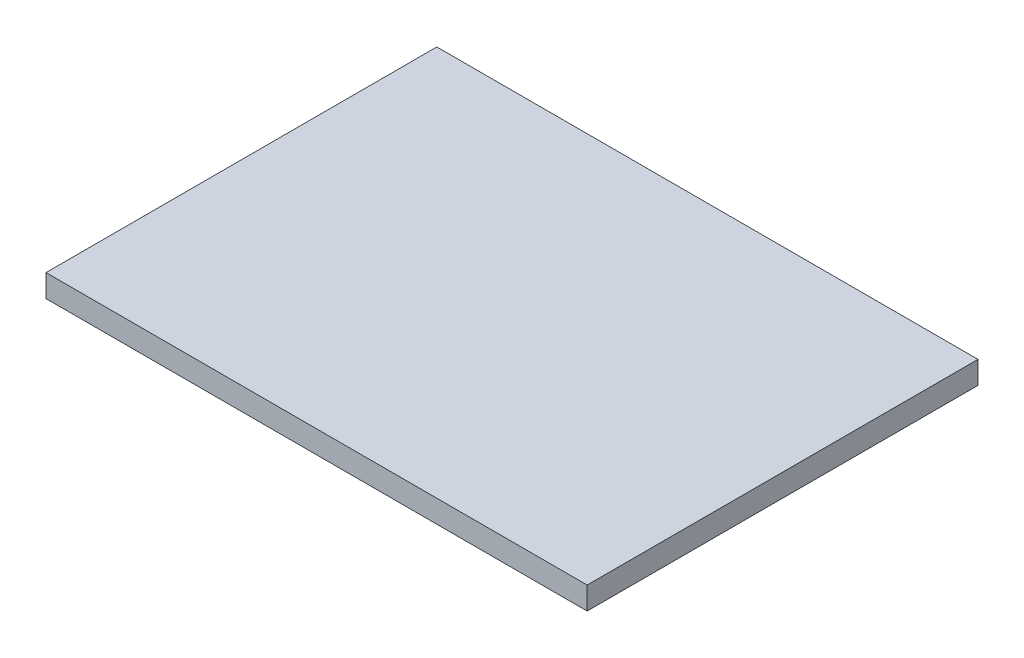
ISO-10303-21;
HEADER;
FILE_DESCRIPTION(('STEP AP214'),'2;1');
FILE_NAME('part.step','',(''),(''),'','','');
FILE_SCHEMA(('AUTOMOTIVE_DESIGN { 1 0 10303 214 1 1 1 1 }'));
ENDSEC;
DATA;
#1=APPLICATION_CONTEXT('core data for automotive mechanical design processes');
#2=APPLICATION_PROTOCOL_DEFINITION('international standard','automotive_design',2000,#1);
#3=PRODUCT_CONTEXT('',#1,'mechanical');
#4=PRODUCT('Part','Part','',(#3));
#5=PRODUCT_RELATED_PRODUCT_CATEGORY('part','',(#4));
#6=PRODUCT_DEFINITION_FORMATION('','',#4);
#7=PRODUCT_DEFINITION_CONTEXT('part definition',#1,'design');
#8=PRODUCT_DEFINITION('design','',#6,#7);
#9=PRODUCT_DEFINITION_SHAPE('','',#8);
#10=(LENGTH_UNIT() NAMED_UNIT(*) SI_UNIT(.MILLI.,.METRE.));
#11=(NAMED_UNIT(*) PLANE_ANGLE_UNIT() SI_UNIT($,.RADIAN.));
#12=(NAMED_UNIT(*) SI_UNIT($,.STERADIAN.) SOLID_ANGLE_UNIT());
#13=UNCERTAINTY_MEASURE_WITH_UNIT(LENGTH_MEASURE(1.E-05),#10,'distance_accuracy_value','');
#14=(GEOMETRIC_REPRESENTATION_CONTEXT(3) GLOBAL_UNCERTAINTY_ASSIGNED_CONTEXT((#13)) GLOBAL_UNIT_ASSIGNED_CONTEXT((#10,
#11,#12)) REPRESENTATION_CONTEXT('',''));
#15=CARTESIAN_POINT('',(0.,0.,0.));
#16=DIRECTION('',(0.,0.,1.));
#17=DIRECTION('',(1.,0.,0.));
#18=AXIS2_PLACEMENT_3D('',#15,#16,#17);
#19=CARTESIAN_POINT('',(36.,3.,26.));
#20=DIRECTION('',(-1.,0.,0.));
#21=DIRECTION('',(0.,0.,1.));
#22=AXIS2_PLACEMENT_3D('',#19,#20,#21);
#23=PLANE('',#22);
#24=DIRECTION('',(0.,0.,-1.));
#25=VECTOR('',#24,1.);
#26=CARTESIAN_POINT('',(36.,0.,26.));
#27=LINE('',#26,#25);
#28=CARTESIAN_POINT('',(36.,0.,26.));
#29=VERTEX_POINT('',#28);
#30=CARTESIAN_POINT('',(36.,0.,-26.));
#31=VERTEX_POINT('',#30);
#32=EDGE_CURVE('E98',#29,#31,#27,.T.);
#33=ORIENTED_EDGE('',*,*,#32,.T.);
#34=DIRECTION('',(0.,-1.,0.));
#35=VECTOR('',#34,1.);
#36=CARTESIAN_POINT('',(36.,3.,-26.));
#37=LINE('',#36,#35);
#38=CARTESIAN_POINT('',(36.,3.,-26.));
#39=VERTEX_POINT('',#38);
#40=EDGE_CURVE('E11',#39,#31,#37,.T.);
#41=ORIENTED_EDGE('',*,*,#40,.F.);
#42=DIRECTION('',(0.,0.,-1.));
#43=VECTOR('',#42,1.);
#44=CARTESIAN_POINT('',(36.,3.,26.));
#45=LINE('',#44,#43);
#46=CARTESIAN_POINT('',(36.,3.,26.));
#47=VERTEX_POINT('',#46);
#48=EDGE_CURVE('E86',#47,#39,#45,.T.);
#49=ORIENTED_EDGE('',*,*,#48,.F.);
#50=DIRECTION('',(0.,-1.,0.));
#51=VECTOR('',#50,1.);
#52=CARTESIAN_POINT('',(36.,3.,26.));
#53=LINE('',#52,#51);
#54=EDGE_CURVE('E94',#47,#29,#53,.T.);
#55=ORIENTED_EDGE('',*,*,#54,.T.);
#56=EDGE_LOOP('',(#33,#41,#49,#55));
#57=FACE_BOUND('',#56,.T.);
#58=ADVANCED_FACE('F35',(#57),#23,.F.);
#59=CARTESIAN_POINT('',(-36.,3.,-26.));
#60=DIRECTION('',(0.,0.,1.));
#61=DIRECTION('',(1.,0.,0.));
#62=AXIS2_PLACEMENT_3D('',#59,#60,#61);
#63=PLANE('',#62);
#64=DIRECTION('',(-1.,0.,0.));
#65=VECTOR('',#64,1.);
#66=CARTESIAN_POINT('',(-36.,0.,-26.));
#67=LINE('',#66,#65);
#68=CARTESIAN_POINT('',(-36.,0.,-26.));
#69=VERTEX_POINT('',#68);
#70=EDGE_CURVE('E90',#31,#69,#67,.T.);
#71=ORIENTED_EDGE('',*,*,#70,.T.);
#72=DIRECTION('',(0.,-1.,0.));
#73=VECTOR('',#72,1.);
#74=CARTESIAN_POINT('',(-36.,3.,-26.));
#75=LINE('',#74,#73);
#76=CARTESIAN_POINT('',(-36.,3.,-26.));
#77=VERTEX_POINT('',#76);
#78=EDGE_CURVE('E43',#77,#69,#75,.T.);
#79=ORIENTED_EDGE('',*,*,#78,.F.);
#80=DIRECTION('',(-1.,0.,0.));
#81=VECTOR('',#80,1.);
#82=CARTESIAN_POINT('',(-36.,3.,-26.));
#83=LINE('',#82,#81);
#84=EDGE_CURVE('E81',#39,#77,#83,.T.);
#85=ORIENTED_EDGE('',*,*,#84,.F.);
#86=ORIENTED_EDGE('',*,*,#40,.T.);
#87=EDGE_LOOP('',(#71,#79,#85,#86));
#88=FACE_BOUND('',#87,.T.);
#89=ADVANCED_FACE('F89',(#88),#63,.F.);
#90=CARTESIAN_POINT('',(-36.,3.,26.));
#91=DIRECTION('',(1.,0.,0.));
#92=DIRECTION('',(0.,0.,-1.));
#93=AXIS2_PLACEMENT_3D('',#90,#91,#92);
#94=PLANE('',#93);
#95=DIRECTION('',(0.,0.,1.));
#96=VECTOR('',#95,1.);
#97=CARTESIAN_POINT('',(-36.,0.,26.));
#98=LINE('',#97,#96);
#99=CARTESIAN_POINT('',(-36.,0.,26.));
#100=VERTEX_POINT('',#99);
#101=EDGE_CURVE('E68',#69,#100,#98,.T.);
#102=ORIENTED_EDGE('',*,*,#101,.T.);
#103=DIRECTION('',(0.,-1.,0.));
#104=VECTOR('',#103,1.);
#105=CARTESIAN_POINT('',(-36.,3.,26.));
#106=LINE('',#105,#104);
#107=CARTESIAN_POINT('',(-36.,3.,26.));
#108=VERTEX_POINT('',#107);
#109=EDGE_CURVE('E91',#108,#100,#106,.T.);
#110=ORIENTED_EDGE('',*,*,#109,.F.);
#111=DIRECTION('',(0.,0.,1.));
#112=VECTOR('',#111,1.);
#113=CARTESIAN_POINT('',(-36.,3.,26.));
#114=LINE('',#113,#112);
#115=EDGE_CURVE('E84',#77,#108,#114,.T.);
#116=ORIENTED_EDGE('',*,*,#115,.F.);
#117=ORIENTED_EDGE('',*,*,#78,.T.);
#118=EDGE_LOOP('',(#102,#110,#116,#117));
#119=FACE_BOUND('',#118,.T.);
#120=ADVANCED_FACE('F92',(#119),#94,.F.);
#121=CARTESIAN_POINT('',(-36.,3.,26.));
#122=DIRECTION('',(0.,0.,-1.));
#123=DIRECTION('',(-1.,0.,0.));
#124=AXIS2_PLACEMENT_3D('',#121,#122,#123);
#125=PLANE('',#124);
#126=DIRECTION('',(1.,0.,0.));
#127=VECTOR('',#126,1.);
#128=CARTESIAN_POINT('',(-36.,0.,26.));
#129=LINE('',#128,#127);
#130=EDGE_CURVE('E74',#100,#29,#129,.T.);
#131=ORIENTED_EDGE('',*,*,#130,.T.);
#132=ORIENTED_EDGE('',*,*,#54,.F.);
#133=DIRECTION('',(1.,0.,0.));
#134=VECTOR('',#133,1.);
#135=CARTESIAN_POINT('',(-36.,3.,26.));
#136=LINE('',#135,#134);
#137=EDGE_CURVE('E51',#108,#47,#136,.T.);
#138=ORIENTED_EDGE('',*,*,#137,.F.);
#139=ORIENTED_EDGE('',*,*,#109,.T.);
#140=EDGE_LOOP('',(#131,#132,#138,#139));
#141=FACE_BOUND('',#140,.T.);
#142=ADVANCED_FACE('F105',(#141),#125,.F.);
#143=CARTESIAN_POINT('',(0.,3.,0.));
#144=DIRECTION('',(0.,-1.,0.));
#145=DIRECTION('',(0.,0.,-1.));
#146=AXIS2_PLACEMENT_3D('',#143,#144,#145);
#147=PLANE('',#146);
#148=ORIENTED_EDGE('',*,*,#48,.T.);
#149=ORIENTED_EDGE('',*,*,#84,.T.);
#150=ORIENTED_EDGE('',*,*,#115,.T.);
#151=ORIENTED_EDGE('',*,*,#137,.T.);
#152=EDGE_LOOP('',(#148,#149,#150,#151));
#153=FACE_BOUND('',#152,.T.);
#154=ADVANCED_FACE('F82',(#153),#147,.F.);
#155=CARTESIAN_POINT('',(0.,0.,0.));
#156=DIRECTION('',(0.,-1.,0.));
#157=DIRECTION('',(0.,0.,-1.));
#158=AXIS2_PLACEMENT_3D('',#155,#156,#157);
#159=PLANE('',#158);
#160=ORIENTED_EDGE('',*,*,#32,.F.);
#161=ORIENTED_EDGE('',*,*,#130,.F.);
#162=ORIENTED_EDGE('',*,*,#101,.F.);
#163=ORIENTED_EDGE('',*,*,#70,.F.);
#164=EDGE_LOOP('',(#160,#161,#162,#163));
#165=FACE_BOUND('',#164,.T.);
#166=ADVANCED_FACE('F108',(#165),#159,.T.);
#167=CLOSED_SHELL('',(#58,#89,#120,#142,#154,#166));
#168=MANIFOLD_SOLID_BREP('B2',#167);
#169=ADVANCED_BREP_SHAPE_REPRESENTATION('',(#18,#168),#14);
#170=SHAPE_DEFINITION_REPRESENTATION(#9,#169);
ENDSEC;
END-ISO-10303-21;
